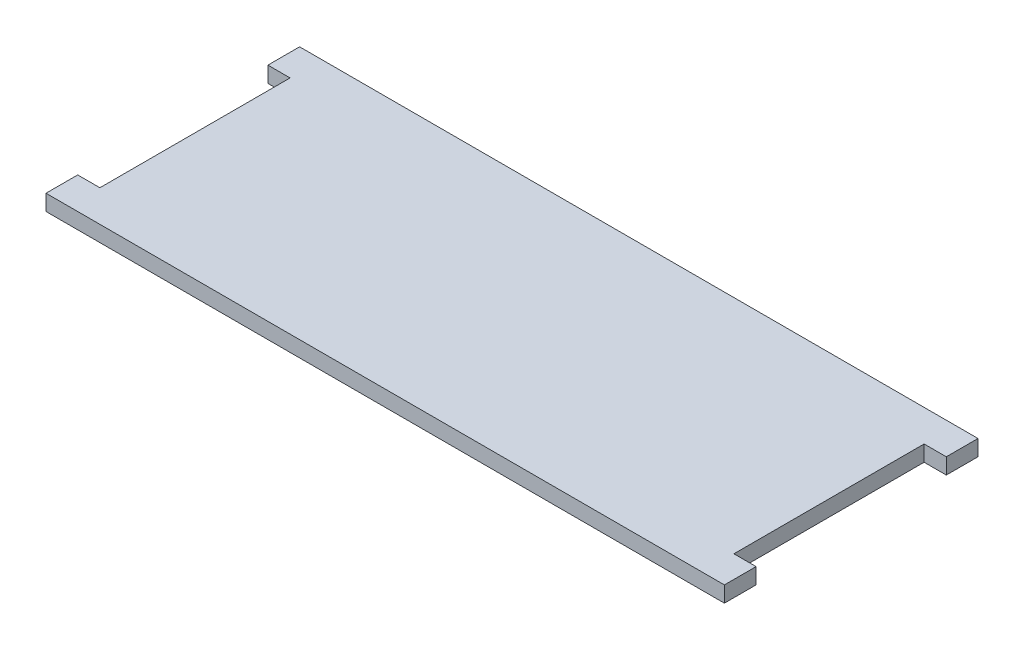
ISO-10303-21;
HEADER;
FILE_DESCRIPTION(('STEP AP214'),'2;1');
FILE_NAME('part.step','',(''),(''),'','','');
FILE_SCHEMA(('AUTOMOTIVE_DESIGN { 1 0 10303 214 1 1 1 1 }'));
ENDSEC;
DATA;
#1=APPLICATION_CONTEXT('core data for automotive mechanical design processes');
#2=APPLICATION_PROTOCOL_DEFINITION('international standard','automotive_design',2000,#1);
#3=PRODUCT_CONTEXT('',#1,'mechanical');
#4=PRODUCT('Part','Part','',(#3));
#5=PRODUCT_RELATED_PRODUCT_CATEGORY('part','',(#4));
#6=PRODUCT_DEFINITION_FORMATION('','',#4);
#7=PRODUCT_DEFINITION_CONTEXT('part definition',#1,'design');
#8=PRODUCT_DEFINITION('design','',#6,#7);
#9=PRODUCT_DEFINITION_SHAPE('','',#8);
#10=(LENGTH_UNIT() NAMED_UNIT(*) SI_UNIT(.MILLI.,.METRE.));
#11=(NAMED_UNIT(*) PLANE_ANGLE_UNIT() SI_UNIT($,.RADIAN.));
#12=(NAMED_UNIT(*) SI_UNIT($,.STERADIAN.) SOLID_ANGLE_UNIT());
#13=UNCERTAINTY_MEASURE_WITH_UNIT(LENGTH_MEASURE(1.E-05),#10,'distance_accuracy_value','');
#14=(GEOMETRIC_REPRESENTATION_CONTEXT(3) GLOBAL_UNCERTAINTY_ASSIGNED_CONTEXT((#13)) GLOBAL_UNIT_ASSIGNED_CONTEXT((#10,
#11,#12)) REPRESENTATION_CONTEXT('',''));
#15=CARTESIAN_POINT('',(0.,0.,0.));
#16=DIRECTION('',(0.,0.,1.));
#17=DIRECTION('',(1.,0.,0.));
#18=AXIS2_PLACEMENT_3D('',#15,#16,#17);
#19=CARTESIAN_POINT('',(63.5,3.175,0.));
#20=DIRECTION('',(1.,0.,0.));
#21=DIRECTION('',(0.,0.,-1.));
#22=AXIS2_PLACEMENT_3D('',#19,#20,#21);
#23=PLANE('',#22);
#24=DIRECTION('',(0.,0.,1.));
#25=VECTOR('',#24,1.);
#26=CARTESIAN_POINT('',(63.5,0.,0.));
#27=LINE('',#26,#25);
#28=CARTESIAN_POINT('',(63.5,0.,-19.05));
#29=VERTEX_POINT('',#28);
#30=CARTESIAN_POINT('',(63.5,0.,19.05));
#31=VERTEX_POINT('',#30);
#32=EDGE_CURVE('E163',#29,#31,#27,.T.);
#33=ORIENTED_EDGE('',*,*,#32,.F.);
#34=DIRECTION('',(0.,-1.,0.));
#35=VECTOR('',#34,1.);
#36=CARTESIAN_POINT('',(63.5,3.175,-19.05));
#37=LINE('',#36,#35);
#38=CARTESIAN_POINT('',(63.5,3.175,-19.05));
#39=VERTEX_POINT('',#38);
#40=EDGE_CURVE('E11',#39,#29,#37,.T.);
#41=ORIENTED_EDGE('',*,*,#40,.F.);
#42=DIRECTION('',(0.,0.,1.));
#43=VECTOR('',#42,1.);
#44=CARTESIAN_POINT('',(63.5,3.175,0.));
#45=LINE('',#44,#43);
#46=CARTESIAN_POINT('',(63.5,3.175,19.05));
#47=VERTEX_POINT('',#46);
#48=EDGE_CURVE('E206',#39,#47,#45,.T.);
#49=ORIENTED_EDGE('',*,*,#48,.T.);
#50=DIRECTION('',(0.,-1.,0.));
#51=VECTOR('',#50,1.);
#52=CARTESIAN_POINT('',(63.5,3.175,19.05));
#53=LINE('',#52,#51);
#54=EDGE_CURVE('E58',#47,#31,#53,.T.);
#55=ORIENTED_EDGE('',*,*,#54,.T.);
#56=EDGE_LOOP('',(#33,#41,#49,#55));
#57=FACE_BOUND('',#56,.T.);
#58=ADVANCED_FACE('F41',(#57),#23,.T.);
#59=CARTESIAN_POINT('',(0.,3.175,-19.05));
#60=DIRECTION('',(0.,0.,-1.));
#61=DIRECTION('',(-1.,0.,0.));
#62=AXIS2_PLACEMENT_3D('',#59,#60,#61);
#63=PLANE('',#62);
#64=DIRECTION('',(1.,0.,0.));
#65=VECTOR('',#64,1.);
#66=CARTESIAN_POINT('',(0.,0.,-19.05));
#67=LINE('',#66,#65);
#68=CARTESIAN_POINT('',(67.945,0.,-19.05));
#69=VERTEX_POINT('',#68);
#70=EDGE_CURVE('E166',#29,#69,#67,.T.);
#71=ORIENTED_EDGE('',*,*,#70,.T.);
#72=DIRECTION('',(0.,-1.,0.));
#73=VECTOR('',#72,1.);
#74=CARTESIAN_POINT('',(67.945,3.175,-19.05));
#75=LINE('',#74,#73);
#76=CARTESIAN_POINT('',(67.945,3.175,-19.05));
#77=VERTEX_POINT('',#76);
#78=EDGE_CURVE('E50',#77,#69,#75,.T.);
#79=ORIENTED_EDGE('',*,*,#78,.F.);
#80=DIRECTION('',(1.,0.,0.));
#81=VECTOR('',#80,1.);
#82=CARTESIAN_POINT('',(0.,3.175,-19.05));
#83=LINE('',#82,#81);
#84=EDGE_CURVE('E252',#39,#77,#83,.T.);
#85=ORIENTED_EDGE('',*,*,#84,.F.);
#86=ORIENTED_EDGE('',*,*,#40,.T.);
#87=EDGE_LOOP('',(#71,#79,#85,#86));
#88=FACE_BOUND('',#87,.T.);
#89=ADVANCED_FACE('F241',(#88),#63,.F.);
#90=CARTESIAN_POINT('',(67.945,3.175,0.));
#91=DIRECTION('',(1.,0.,0.));
#92=DIRECTION('',(0.,0.,-1.));
#93=AXIS2_PLACEMENT_3D('',#90,#91,#92);
#94=PLANE('',#93);
#95=DIRECTION('',(0.,0.,1.));
#96=VECTOR('',#95,1.);
#97=CARTESIAN_POINT('',(67.945,0.,0.));
#98=LINE('',#97,#96);
#99=CARTESIAN_POINT('',(67.945,0.,-25.4));
#100=VERTEX_POINT('',#99);
#101=EDGE_CURVE('E170',#100,#69,#98,.T.);
#102=ORIENTED_EDGE('',*,*,#101,.F.);
#103=DIRECTION('',(0.,-1.,0.));
#104=VECTOR('',#103,1.);
#105=CARTESIAN_POINT('',(67.945,3.175,-25.4));
#106=LINE('',#105,#104);
#107=CARTESIAN_POINT('',(67.945,3.175,-25.4));
#108=VERTEX_POINT('',#107);
#109=EDGE_CURVE('E229',#108,#100,#106,.T.);
#110=ORIENTED_EDGE('',*,*,#109,.F.);
#111=DIRECTION('',(0.,0.,1.));
#112=VECTOR('',#111,1.);
#113=CARTESIAN_POINT('',(67.945,3.175,0.));
#114=LINE('',#113,#112);
#115=EDGE_CURVE('E238',#108,#77,#114,.T.);
#116=ORIENTED_EDGE('',*,*,#115,.T.);
#117=ORIENTED_EDGE('',*,*,#78,.T.);
#118=EDGE_LOOP('',(#102,#110,#116,#117));
#119=FACE_BOUND('',#118,.T.);
#120=ADVANCED_FACE('F236',(#119),#94,.T.);
#121=CARTESIAN_POINT('',(0.,3.175,-25.4));
#122=DIRECTION('',(0.,0.,-1.));
#123=DIRECTION('',(-1.,0.,0.));
#124=AXIS2_PLACEMENT_3D('',#121,#122,#123);
#125=PLANE('',#124);
#126=DIRECTION('',(1.,0.,0.));
#127=VECTOR('',#126,1.);
#128=CARTESIAN_POINT('',(0.,0.,-25.4));
#129=LINE('',#128,#127);
#130=CARTESIAN_POINT('',(-67.945,0.,-25.4));
#131=VERTEX_POINT('',#130);
#132=EDGE_CURVE('E174',#131,#100,#129,.T.);
#133=ORIENTED_EDGE('',*,*,#132,.F.);
#134=DIRECTION('',(0.,-1.,0.));
#135=VECTOR('',#134,1.);
#136=CARTESIAN_POINT('',(-67.945,3.175,-25.4));
#137=LINE('',#136,#135);
#138=CARTESIAN_POINT('',(-67.945,3.175,-25.4));
#139=VERTEX_POINT('',#138);
#140=EDGE_CURVE('E226',#139,#131,#137,.T.);
#141=ORIENTED_EDGE('',*,*,#140,.F.);
#142=DIRECTION('',(1.,0.,0.));
#143=VECTOR('',#142,1.);
#144=CARTESIAN_POINT('',(0.,3.175,-25.4));
#145=LINE('',#144,#143);
#146=EDGE_CURVE('E251',#139,#108,#145,.T.);
#147=ORIENTED_EDGE('',*,*,#146,.T.);
#148=ORIENTED_EDGE('',*,*,#109,.T.);
#149=EDGE_LOOP('',(#133,#141,#147,#148));
#150=FACE_BOUND('',#149,.T.);
#151=ADVANCED_FACE('F247',(#150),#125,.T.);
#152=CARTESIAN_POINT('',(-67.945,3.175,0.));
#153=DIRECTION('',(1.,0.,0.));
#154=DIRECTION('',(0.,0.,-1.));
#155=AXIS2_PLACEMENT_3D('',#152,#153,#154);
#156=PLANE('',#155);
#157=DIRECTION('',(0.,0.,1.));
#158=VECTOR('',#157,1.);
#159=CARTESIAN_POINT('',(-67.945,0.,0.));
#160=LINE('',#159,#158);
#161=CARTESIAN_POINT('',(-67.945,0.,-19.05));
#162=VERTEX_POINT('',#161);
#163=EDGE_CURVE('E178',#131,#162,#160,.T.);
#164=ORIENTED_EDGE('',*,*,#163,.T.);
#165=DIRECTION('',(0.,-1.,0.));
#166=VECTOR('',#165,1.);
#167=CARTESIAN_POINT('',(-67.945,3.175,-19.05));
#168=LINE('',#167,#166);
#169=CARTESIAN_POINT('',(-67.945,3.175,-19.05));
#170=VERTEX_POINT('',#169);
#171=EDGE_CURVE('E223',#170,#162,#168,.T.);
#172=ORIENTED_EDGE('',*,*,#171,.F.);
#173=DIRECTION('',(0.,0.,1.));
#174=VECTOR('',#173,1.);
#175=CARTESIAN_POINT('',(-67.945,3.175,0.));
#176=LINE('',#175,#174);
#177=EDGE_CURVE('E257',#139,#170,#176,.T.);
#178=ORIENTED_EDGE('',*,*,#177,.F.);
#179=ORIENTED_EDGE('',*,*,#140,.T.);
#180=EDGE_LOOP('',(#164,#172,#178,#179));
#181=FACE_BOUND('',#180,.T.);
#182=ADVANCED_FACE('F300',(#181),#156,.F.);
#183=CARTESIAN_POINT('',(0.,3.175,-19.05));
#184=DIRECTION('',(0.,0.,1.));
#185=DIRECTION('',(1.,0.,0.));
#186=AXIS2_PLACEMENT_3D('',#183,#184,#185);
#187=PLANE('',#186);
#188=DIRECTION('',(-1.,0.,0.));
#189=VECTOR('',#188,1.);
#190=CARTESIAN_POINT('',(0.,0.,-19.05));
#191=LINE('',#190,#189);
#192=CARTESIAN_POINT('',(-63.5,0.,-19.05));
#193=VERTEX_POINT('',#192);
#194=EDGE_CURVE('E182',#193,#162,#191,.T.);
#195=ORIENTED_EDGE('',*,*,#194,.F.);
#196=DIRECTION('',(0.,-1.,0.));
#197=VECTOR('',#196,1.);
#198=CARTESIAN_POINT('',(-63.5,3.175,-19.05));
#199=LINE('',#198,#197);
#200=CARTESIAN_POINT('',(-63.5,3.175,-19.05));
#201=VERTEX_POINT('',#200);
#202=EDGE_CURVE('E220',#201,#193,#199,.T.);
#203=ORIENTED_EDGE('',*,*,#202,.F.);
#204=DIRECTION('',(-1.,0.,0.));
#205=VECTOR('',#204,1.);
#206=CARTESIAN_POINT('',(0.,3.175,-19.05));
#207=LINE('',#206,#205);
#208=EDGE_CURVE('E264',#201,#170,#207,.T.);
#209=ORIENTED_EDGE('',*,*,#208,.T.);
#210=ORIENTED_EDGE('',*,*,#171,.T.);
#211=EDGE_LOOP('',(#195,#203,#209,#210));
#212=FACE_BOUND('',#211,.T.);
#213=ADVANCED_FACE('F303',(#212),#187,.T.);
#214=CARTESIAN_POINT('',(-63.5,3.175,0.));
#215=DIRECTION('',(1.,0.,0.));
#216=DIRECTION('',(0.,0.,-1.));
#217=AXIS2_PLACEMENT_3D('',#214,#215,#216);
#218=PLANE('',#217);
#219=DIRECTION('',(0.,0.,1.));
#220=VECTOR('',#219,1.);
#221=CARTESIAN_POINT('',(-63.5,0.,0.));
#222=LINE('',#221,#220);
#223=CARTESIAN_POINT('',(-63.5,0.,19.05));
#224=VERTEX_POINT('',#223);
#225=EDGE_CURVE('E186',#193,#224,#222,.T.);
#226=ORIENTED_EDGE('',*,*,#225,.T.);
#227=DIRECTION('',(0.,-1.,0.));
#228=VECTOR('',#227,1.);
#229=CARTESIAN_POINT('',(-63.5,3.175,19.05));
#230=LINE('',#229,#228);
#231=CARTESIAN_POINT('',(-63.5,3.175,19.05));
#232=VERTEX_POINT('',#231);
#233=EDGE_CURVE('E216',#232,#224,#230,.T.);
#234=ORIENTED_EDGE('',*,*,#233,.F.);
#235=DIRECTION('',(0.,0.,1.));
#236=VECTOR('',#235,1.);
#237=CARTESIAN_POINT('',(-63.5,3.175,0.));
#238=LINE('',#237,#236);
#239=EDGE_CURVE('E268',#201,#232,#238,.T.);
#240=ORIENTED_EDGE('',*,*,#239,.F.);
#241=ORIENTED_EDGE('',*,*,#202,.T.);
#242=EDGE_LOOP('',(#226,#234,#240,#241));
#243=FACE_BOUND('',#242,.T.);
#244=ADVANCED_FACE('F307',(#243),#218,.F.);
#245=CARTESIAN_POINT('',(0.,3.175,19.05));
#246=DIRECTION('',(0.,0.,1.));
#247=DIRECTION('',(1.,0.,0.));
#248=AXIS2_PLACEMENT_3D('',#245,#246,#247);
#249=PLANE('',#248);
#250=DIRECTION('',(-1.,0.,0.));
#251=VECTOR('',#250,1.);
#252=CARTESIAN_POINT('',(0.,0.,19.05));
#253=LINE('',#252,#251);
#254=CARTESIAN_POINT('',(-67.945,0.,19.05));
#255=VERTEX_POINT('',#254);
#256=EDGE_CURVE('E189',#224,#255,#253,.T.);
#257=ORIENTED_EDGE('',*,*,#256,.T.);
#258=DIRECTION('',(0.,-1.,0.));
#259=VECTOR('',#258,1.);
#260=CARTESIAN_POINT('',(-67.945,3.175,19.05));
#261=LINE('',#260,#259);
#262=CARTESIAN_POINT('',(-67.945,3.175,19.05));
#263=VERTEX_POINT('',#262);
#264=EDGE_CURVE('E213',#263,#255,#261,.T.);
#265=ORIENTED_EDGE('',*,*,#264,.F.);
#266=DIRECTION('',(-1.,0.,0.));
#267=VECTOR('',#266,1.);
#268=CARTESIAN_POINT('',(0.,3.175,19.05));
#269=LINE('',#268,#267);
#270=EDGE_CURVE('E271',#232,#263,#269,.T.);
#271=ORIENTED_EDGE('',*,*,#270,.F.);
#272=ORIENTED_EDGE('',*,*,#233,.T.);
#273=EDGE_LOOP('',(#257,#265,#271,#272));
#274=FACE_BOUND('',#273,.T.);
#275=ADVANCED_FACE('F311',(#274),#249,.F.);
#276=CARTESIAN_POINT('',(-67.945,3.175,0.));
#277=DIRECTION('',(-1.,0.,0.));
#278=DIRECTION('',(0.,0.,1.));
#279=AXIS2_PLACEMENT_3D('',#276,#277,#278);
#280=PLANE('',#279);
#281=DIRECTION('',(0.,0.,-1.));
#282=VECTOR('',#281,1.);
#283=CARTESIAN_POINT('',(-67.945,0.,0.));
#284=LINE('',#283,#282);
#285=CARTESIAN_POINT('',(-67.945,0.,25.4));
#286=VERTEX_POINT('',#285);
#287=EDGE_CURVE('E193',#286,#255,#284,.T.);
#288=ORIENTED_EDGE('',*,*,#287,.F.);
#289=DIRECTION('',(0.,-1.,0.));
#290=VECTOR('',#289,1.);
#291=CARTESIAN_POINT('',(-67.945,3.175,25.4));
#292=LINE('',#291,#290);
#293=CARTESIAN_POINT('',(-67.945,3.175,25.4));
#294=VERTEX_POINT('',#293);
#295=EDGE_CURVE('E153',#294,#286,#292,.T.);
#296=ORIENTED_EDGE('',*,*,#295,.F.);
#297=DIRECTION('',(0.,0.,-1.));
#298=VECTOR('',#297,1.);
#299=CARTESIAN_POINT('',(-67.945,3.175,0.));
#300=LINE('',#299,#298);
#301=EDGE_CURVE('E141',#294,#263,#300,.T.);
#302=ORIENTED_EDGE('',*,*,#301,.T.);
#303=ORIENTED_EDGE('',*,*,#264,.T.);
#304=EDGE_LOOP('',(#288,#296,#302,#303));
#305=FACE_BOUND('',#304,.T.);
#306=ADVANCED_FACE('F276',(#305),#280,.T.);
#307=CARTESIAN_POINT('',(0.,3.175,25.4));
#308=DIRECTION('',(0.,0.,-1.));
#309=DIRECTION('',(-1.,0.,0.));
#310=AXIS2_PLACEMENT_3D('',#307,#308,#309);
#311=PLANE('',#310);
#312=DIRECTION('',(1.,0.,0.));
#313=VECTOR('',#312,1.);
#314=CARTESIAN_POINT('',(0.,0.,25.4));
#315=LINE('',#314,#313);
#316=CARTESIAN_POINT('',(67.945,0.,25.4));
#317=VERTEX_POINT('',#316);
#318=EDGE_CURVE('E149',#286,#317,#315,.T.);
#319=ORIENTED_EDGE('',*,*,#318,.T.);
#320=DIRECTION('',(0.,-1.,0.));
#321=VECTOR('',#320,1.);
#322=CARTESIAN_POINT('',(67.945,3.175,25.4));
#323=LINE('',#322,#321);
#324=CARTESIAN_POINT('',(67.945,3.175,25.4));
#325=VERTEX_POINT('',#324);
#326=EDGE_CURVE('E146',#325,#317,#323,.T.);
#327=ORIENTED_EDGE('',*,*,#326,.F.);
#328=DIRECTION('',(1.,0.,0.));
#329=VECTOR('',#328,1.);
#330=CARTESIAN_POINT('',(0.,3.175,25.4));
#331=LINE('',#330,#329);
#332=EDGE_CURVE('E133',#294,#325,#331,.T.);
#333=ORIENTED_EDGE('',*,*,#332,.F.);
#334=ORIENTED_EDGE('',*,*,#295,.T.);
#335=EDGE_LOOP('',(#319,#327,#333,#334));
#336=FACE_BOUND('',#335,.T.);
#337=ADVANCED_FACE('F147',(#336),#311,.F.);
#338=CARTESIAN_POINT('',(67.945,3.175,0.));
#339=DIRECTION('',(-1.,0.,0.));
#340=DIRECTION('',(0.,0.,1.));
#341=AXIS2_PLACEMENT_3D('',#338,#339,#340);
#342=PLANE('',#341);
#343=DIRECTION('',(0.,0.,-1.));
#344=VECTOR('',#343,1.);
#345=CARTESIAN_POINT('',(67.945,0.,0.));
#346=LINE('',#345,#344);
#347=CARTESIAN_POINT('',(67.945,0.,19.05));
#348=VERTEX_POINT('',#347);
#349=EDGE_CURVE('E199',#317,#348,#346,.T.);
#350=ORIENTED_EDGE('',*,*,#349,.T.);
#351=DIRECTION('',(0.,-1.,0.));
#352=VECTOR('',#351,1.);
#353=CARTESIAN_POINT('',(67.945,3.175,19.05));
#354=LINE('',#353,#352);
#355=CARTESIAN_POINT('',(67.945,3.175,19.05));
#356=VERTEX_POINT('',#355);
#357=EDGE_CURVE('E96',#356,#348,#354,.T.);
#358=ORIENTED_EDGE('',*,*,#357,.F.);
#359=DIRECTION('',(0.,0.,-1.));
#360=VECTOR('',#359,1.);
#361=CARTESIAN_POINT('',(67.945,3.175,0.));
#362=LINE('',#361,#360);
#363=EDGE_CURVE('E139',#325,#356,#362,.T.);
#364=ORIENTED_EDGE('',*,*,#363,.F.);
#365=ORIENTED_EDGE('',*,*,#326,.T.);
#366=EDGE_LOOP('',(#350,#358,#364,#365));
#367=FACE_BOUND('',#366,.T.);
#368=ADVANCED_FACE('F155',(#367),#342,.F.);
#369=CARTESIAN_POINT('',(0.,3.175,19.05));
#370=DIRECTION('',(0.,0.,-1.));
#371=DIRECTION('',(-1.,0.,0.));
#372=AXIS2_PLACEMENT_3D('',#369,#370,#371);
#373=PLANE('',#372);
#374=DIRECTION('',(1.,0.,0.));
#375=VECTOR('',#374,1.);
#376=CARTESIAN_POINT('',(0.,0.,19.05));
#377=LINE('',#376,#375);
#378=EDGE_CURVE('E202',#31,#348,#377,.T.);
#379=ORIENTED_EDGE('',*,*,#378,.F.);
#380=ORIENTED_EDGE('',*,*,#54,.F.);
#381=DIRECTION('',(1.,0.,0.));
#382=VECTOR('',#381,1.);
#383=CARTESIAN_POINT('',(0.,3.175,19.05));
#384=LINE('',#383,#382);
#385=EDGE_CURVE('E157',#47,#356,#384,.T.);
#386=ORIENTED_EDGE('',*,*,#385,.T.);
#387=ORIENTED_EDGE('',*,*,#357,.T.);
#388=EDGE_LOOP('',(#379,#380,#386,#387));
#389=FACE_BOUND('',#388,.T.);
#390=ADVANCED_FACE('F279',(#389),#373,.T.);
#391=CARTESIAN_POINT('',(0.,3.175,0.));
#392=DIRECTION('',(0.,1.,0.));
#393=DIRECTION('',(0.,0.,1.));
#394=AXIS2_PLACEMENT_3D('',#391,#392,#393);
#395=PLANE('',#394);
#396=ORIENTED_EDGE('',*,*,#48,.F.);
#397=ORIENTED_EDGE('',*,*,#84,.T.);
#398=ORIENTED_EDGE('',*,*,#115,.F.);
#399=ORIENTED_EDGE('',*,*,#146,.F.);
#400=ORIENTED_EDGE('',*,*,#177,.T.);
#401=ORIENTED_EDGE('',*,*,#208,.F.);
#402=ORIENTED_EDGE('',*,*,#239,.T.);
#403=ORIENTED_EDGE('',*,*,#270,.T.);
#404=ORIENTED_EDGE('',*,*,#301,.F.);
#405=ORIENTED_EDGE('',*,*,#332,.T.);
#406=ORIENTED_EDGE('',*,*,#363,.T.);
#407=ORIENTED_EDGE('',*,*,#385,.F.);
#408=EDGE_LOOP('',(#396,#397,#398,#399,#400,#401,#402,#403,#404,#405,#406,#407));
#409=FACE_BOUND('',#408,.T.);
#410=ADVANCED_FACE('F136',(#409),#395,.T.);
#411=CARTESIAN_POINT('',(0.,0.,0.));
#412=DIRECTION('',(0.,1.,0.));
#413=DIRECTION('',(0.,0.,1.));
#414=AXIS2_PLACEMENT_3D('',#411,#412,#413);
#415=PLANE('',#414);
#416=ORIENTED_EDGE('',*,*,#32,.T.);
#417=ORIENTED_EDGE('',*,*,#378,.T.);
#418=ORIENTED_EDGE('',*,*,#349,.F.);
#419=ORIENTED_EDGE('',*,*,#318,.F.);
#420=ORIENTED_EDGE('',*,*,#287,.T.);
#421=ORIENTED_EDGE('',*,*,#256,.F.);
#422=ORIENTED_EDGE('',*,*,#225,.F.);
#423=ORIENTED_EDGE('',*,*,#194,.T.);
#424=ORIENTED_EDGE('',*,*,#163,.F.);
#425=ORIENTED_EDGE('',*,*,#132,.T.);
#426=ORIENTED_EDGE('',*,*,#101,.T.);
#427=ORIENTED_EDGE('',*,*,#70,.F.);
#428=EDGE_LOOP('',(#416,#417,#418,#419,#420,#421,#422,#423,#424,#425,#426,#427));
#429=FACE_BOUND('',#428,.T.);
#430=ADVANCED_FACE('F243',(#429),#415,.F.);
#431=CLOSED_SHELL('',(#58,#89,#120,#151,#182,#213,#244,#275,#306,#337,#368,#390,#410,#430));
#432=MANIFOLD_SOLID_BREP('B2',#431);
#433=ADVANCED_BREP_SHAPE_REPRESENTATION('',(#18,#432),#14);
#434=SHAPE_DEFINITION_REPRESENTATION(#9,#433);
ENDSEC;
END-ISO-10303-21;
